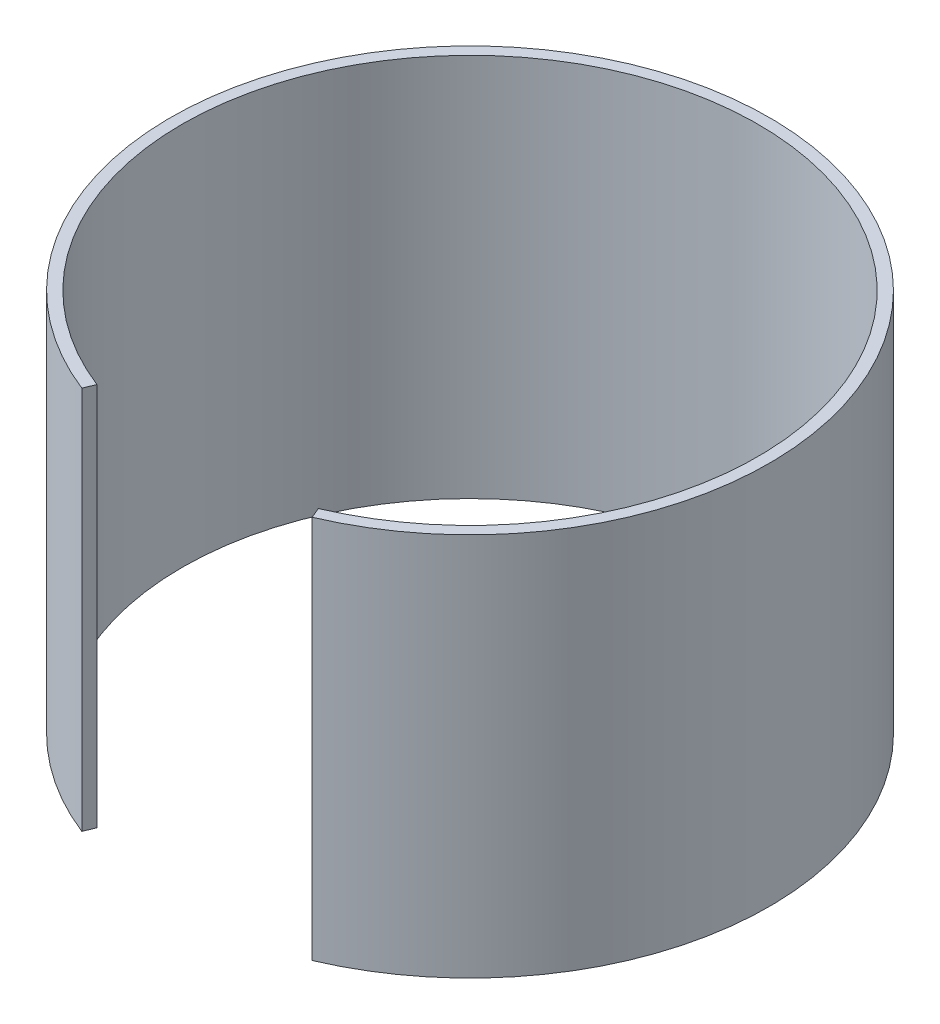
ISO-10303-21;
HEADER;
FILE_DESCRIPTION(('STEP AP214'),'2;1');
FILE_NAME('part.step','',(''),(''),'','','');
FILE_SCHEMA(('AUTOMOTIVE_DESIGN { 1 0 10303 214 1 1 1 1 }'));
ENDSEC;
DATA;
#1=APPLICATION_CONTEXT('core data for automotive mechanical design processes');
#2=APPLICATION_PROTOCOL_DEFINITION('international standard','automotive_design',2000,#1);
#3=PRODUCT_CONTEXT('',#1,'mechanical');
#4=PRODUCT('Part','Part','',(#3));
#5=PRODUCT_RELATED_PRODUCT_CATEGORY('part','',(#4));
#6=PRODUCT_DEFINITION_FORMATION('','',#4);
#7=PRODUCT_DEFINITION_CONTEXT('part definition',#1,'design');
#8=PRODUCT_DEFINITION('design','',#6,#7);
#9=PRODUCT_DEFINITION_SHAPE('','',#8);
#10=(LENGTH_UNIT() NAMED_UNIT(*) SI_UNIT(.MILLI.,.METRE.));
#11=(NAMED_UNIT(*) PLANE_ANGLE_UNIT() SI_UNIT($,.RADIAN.));
#12=(NAMED_UNIT(*) SI_UNIT($,.STERADIAN.) SOLID_ANGLE_UNIT());
#13=UNCERTAINTY_MEASURE_WITH_UNIT(LENGTH_MEASURE(1.E-05),#10,'distance_accuracy_value','');
#14=(GEOMETRIC_REPRESENTATION_CONTEXT(3) GLOBAL_UNCERTAINTY_ASSIGNED_CONTEXT((#13)) GLOBAL_UNIT_ASSIGNED_CONTEXT((#10,
#11,#12)) REPRESENTATION_CONTEXT('',''));
#15=CARTESIAN_POINT('',(0.,0.,0.));
#16=DIRECTION('',(0.,0.,1.));
#17=DIRECTION('',(1.,0.,0.));
#18=AXIS2_PLACEMENT_3D('',#15,#16,#17);
#19=CARTESIAN_POINT('',(0.,50.,0.));
#20=DIRECTION('',(0.,-1.,0.));
#21=DIRECTION('',(0.,0.,-1.));
#22=AXIS2_PLACEMENT_3D('',#19,#20,#21);
#23=CYLINDRICAL_SURFACE('',#22,39.);
#24=CARTESIAN_POINT('',(0.,0.,0.));
#25=DIRECTION('',(0.,1.,0.));
#26=DIRECTION('',(0.,0.,1.));
#27=AXIS2_PLACEMENT_3D('',#24,#25,#26);
#28=CIRCLE('',#27,39.);
#29=CARTESIAN_POINT('',(15.309382725251,0.,35.8695246772492));
#30=VERTEX_POINT('',#29);
#31=CARTESIAN_POINT('',(-14.2506893976285,0.,36.3031383174006));
#32=VERTEX_POINT('',#31);
#33=EDGE_CURVE('E96',#30,#32,#28,.T.);
#34=ORIENTED_EDGE('',*,*,#33,.T.);
#35=DIRECTION('',(0.,-1.,0.));
#36=VECTOR('',#35,1.);
#37=CARTESIAN_POINT('',(-14.2506893976285,50.,36.3031383174006));
#38=LINE('',#37,#36);
#39=CARTESIAN_POINT('',(-14.2506893976285,50.,36.3031383174006));
#40=VERTEX_POINT('',#39);
#41=EDGE_CURVE('E11',#40,#32,#38,.T.);
#42=ORIENTED_EDGE('',*,*,#41,.F.);
#43=CARTESIAN_POINT('',(0.,50.,0.));
#44=DIRECTION('',(0.,1.,0.));
#45=DIRECTION('',(0.,0.,1.));
#46=AXIS2_PLACEMENT_3D('',#43,#44,#45);
#47=CIRCLE('',#46,39.);
#48=CARTESIAN_POINT('',(15.309382725251,50.,35.8695246772492));
#49=VERTEX_POINT('',#48);
#50=EDGE_CURVE('E84',#49,#40,#47,.T.);
#51=ORIENTED_EDGE('',*,*,#50,.F.);
#52=DIRECTION('',(0.,-1.,0.));
#53=VECTOR('',#52,1.);
#54=CARTESIAN_POINT('',(15.309382725251,50.,35.8695246772492));
#55=LINE('',#54,#53);
#56=EDGE_CURVE('E92',#49,#30,#55,.T.);
#57=ORIENTED_EDGE('',*,*,#56,.T.);
#58=EDGE_LOOP('',(#34,#42,#51,#57));
#59=FACE_BOUND('',#58,.T.);
#60=ADVANCED_FACE('F33',(#59),#23,.T.);
#61=CARTESIAN_POINT('',(-14.2506893976285,50.,36.3031383174006));
#62=DIRECTION('',(-0.92387953251129,0.,-0.382683432365082));
#63=DIRECTION('',(-0.382683432365082,0.,0.92387953251129));
#64=AXIS2_PLACEMENT_3D('',#61,#62,#63);
#65=PLANE('',#64);
#66=DIRECTION('',(0.382683432365082,0.,-0.92387953251129));
#67=VECTOR('',#66,1.);
#68=CARTESIAN_POINT('',(-14.2506893976285,0.,36.3031383174006));
#69=LINE('',#68,#67);
#70=CARTESIAN_POINT('',(-13.6765605869116,0.,34.9170687560187));
#71=VERTEX_POINT('',#70);
#72=EDGE_CURVE('E88',#32,#71,#69,.T.);
#73=ORIENTED_EDGE('',*,*,#72,.T.);
#74=DIRECTION('',(0.,-1.,0.));
#75=VECTOR('',#74,1.);
#76=CARTESIAN_POINT('',(-13.6765605869116,50.,34.9170687560187));
#77=LINE('',#76,#75);
#78=CARTESIAN_POINT('',(-13.6765605869116,50.,34.9170687560187));
#79=VERTEX_POINT('',#78);
#80=EDGE_CURVE('E41',#79,#71,#77,.T.);
#81=ORIENTED_EDGE('',*,*,#80,.F.);
#82=DIRECTION('',(0.382683432365082,0.,-0.92387953251129));
#83=VECTOR('',#82,1.);
#84=CARTESIAN_POINT('',(-14.2506893976285,50.,36.3031383174006));
#85=LINE('',#84,#83);
#86=EDGE_CURVE('E79',#40,#79,#85,.T.);
#87=ORIENTED_EDGE('',*,*,#86,.F.);
#88=ORIENTED_EDGE('',*,*,#41,.T.);
#89=EDGE_LOOP('',(#73,#81,#87,#88));
#90=FACE_BOUND('',#89,.T.);
#91=ADVANCED_FACE('F87',(#90),#65,.F.);
#92=CARTESIAN_POINT('',(0.,50.,0.));
#93=DIRECTION('',(0.,-1.,0.));
#94=DIRECTION('',(0.,0.,-1.));
#95=AXIS2_PLACEMENT_3D('',#92,#93,#94);
#96=CYLINDRICAL_SURFACE('',#95,37.5);
#97=CARTESIAN_POINT('',(0.,0.,0.));
#98=DIRECTION('',(0.,-1.,0.));
#99=DIRECTION('',(0.,0.,1.));
#100=AXIS2_PLACEMENT_3D('',#97,#98,#99);
#101=CIRCLE('',#100,37.5);
#102=CARTESIAN_POINT('',(14.7353233905706,0.,34.4836228458569));
#103=VERTEX_POINT('',#102);
#104=EDGE_CURVE('E66',#71,#103,#101,.T.);
#105=ORIENTED_EDGE('',*,*,#104,.T.);
#106=DIRECTION('',(0.,-1.,0.));
#107=VECTOR('',#106,1.);
#108=CARTESIAN_POINT('',(14.7353233905706,50.,34.4836228458569));
#109=LINE('',#108,#107);
#110=CARTESIAN_POINT('',(14.7353233905706,50.,34.4836228458569));
#111=VERTEX_POINT('',#110);
#112=EDGE_CURVE('E89',#111,#103,#109,.T.);
#113=ORIENTED_EDGE('',*,*,#112,.F.);
#114=CARTESIAN_POINT('',(0.,50.,0.));
#115=DIRECTION('',(0.,-1.,0.));
#116=DIRECTION('',(0.,0.,1.));
#117=AXIS2_PLACEMENT_3D('',#114,#115,#116);
#118=CIRCLE('',#117,37.5);
#119=EDGE_CURVE('E82',#79,#111,#118,.T.);
#120=ORIENTED_EDGE('',*,*,#119,.F.);
#121=ORIENTED_EDGE('',*,*,#80,.T.);
#122=EDGE_LOOP('',(#105,#113,#120,#121));
#123=FACE_BOUND('',#122,.T.);
#124=ADVANCED_FACE('F90',(#123),#96,.F.);
#125=CARTESIAN_POINT('',(15.309382725251,50.,35.8695246772492));
#126=DIRECTION('',(0.923879532511289,0.,-0.382683432365084));
#127=DIRECTION('',(-0.382683432365084,0.,-0.923879532511289));
#128=AXIS2_PLACEMENT_3D('',#125,#126,#127);
#129=PLANE('',#128);
#130=DIRECTION('',(0.382683432365084,0.,0.923879532511289));
#131=VECTOR('',#130,1.);
#132=CARTESIAN_POINT('',(15.309382725251,0.,35.8695246772492));
#133=LINE('',#132,#131);
#134=EDGE_CURVE('E72',#103,#30,#133,.T.);
#135=ORIENTED_EDGE('',*,*,#134,.T.);
#136=ORIENTED_EDGE('',*,*,#56,.F.);
#137=DIRECTION('',(0.382683432365084,0.,0.923879532511289));
#138=VECTOR('',#137,1.);
#139=CARTESIAN_POINT('',(15.309382725251,50.,35.8695246772492));
#140=LINE('',#139,#138);
#141=EDGE_CURVE('E49',#111,#49,#140,.T.);
#142=ORIENTED_EDGE('',*,*,#141,.F.);
#143=ORIENTED_EDGE('',*,*,#112,.T.);
#144=EDGE_LOOP('',(#135,#136,#142,#143));
#145=FACE_BOUND('',#144,.T.);
#146=ADVANCED_FACE('F103',(#145),#129,.F.);
#147=CARTESIAN_POINT('',(0.,50.,0.));
#148=DIRECTION('',(0.,1.,0.));
#149=DIRECTION('',(0.,0.,1.));
#150=AXIS2_PLACEMENT_3D('',#147,#148,#149);
#151=PLANE('',#150);
#152=ORIENTED_EDGE('',*,*,#50,.T.);
#153=ORIENTED_EDGE('',*,*,#86,.T.);
#154=ORIENTED_EDGE('',*,*,#119,.T.);
#155=ORIENTED_EDGE('',*,*,#141,.T.);
#156=EDGE_LOOP('',(#152,#153,#154,#155));
#157=FACE_BOUND('',#156,.T.);
#158=ADVANCED_FACE('F80',(#157),#151,.T.);
#159=CARTESIAN_POINT('',(0.,0.,0.));
#160=DIRECTION('',(0.,1.,0.));
#161=DIRECTION('',(0.,0.,1.));
#162=AXIS2_PLACEMENT_3D('',#159,#160,#161);
#163=PLANE('',#162);
#164=ORIENTED_EDGE('',*,*,#33,.F.);
#165=ORIENTED_EDGE('',*,*,#134,.F.);
#166=ORIENTED_EDGE('',*,*,#104,.F.);
#167=ORIENTED_EDGE('',*,*,#72,.F.);
#168=EDGE_LOOP('',(#164,#165,#166,#167));
#169=FACE_BOUND('',#168,.T.);
#170=ADVANCED_FACE('F106',(#169),#163,.F.);
#171=CLOSED_SHELL('',(#60,#91,#124,#146,#158,#170));
#172=MANIFOLD_SOLID_BREP('B2',#171);
#173=ADVANCED_BREP_SHAPE_REPRESENTATION('',(#18,#172),#14);
#174=SHAPE_DEFINITION_REPRESENTATION(#9,#173);
ENDSEC;
END-ISO-10303-21;
